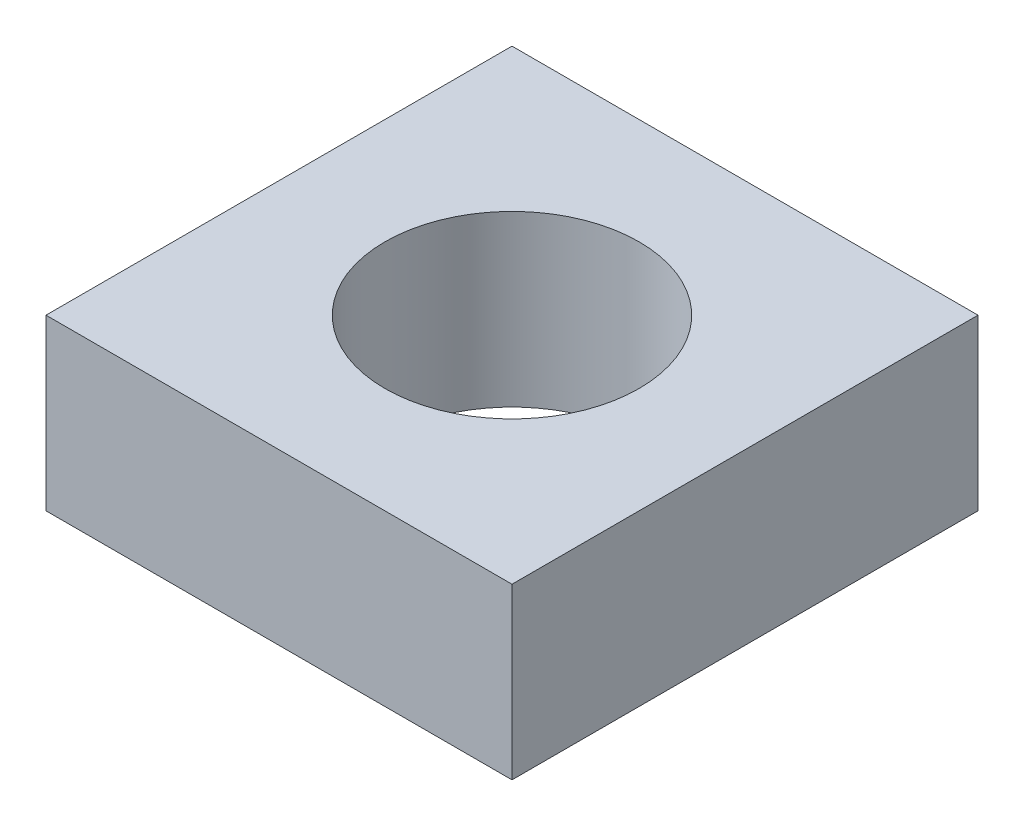
ISO-10303-21;
HEADER;
FILE_DESCRIPTION(('STEP AP214'),'2;1');
FILE_NAME('part.step','',(''),(''),'','','');
FILE_SCHEMA(('AUTOMOTIVE_DESIGN { 1 0 10303 214 1 1 1 1 }'));
ENDSEC;
DATA;
#1=APPLICATION_CONTEXT('core data for automotive mechanical design processes');
#2=APPLICATION_PROTOCOL_DEFINITION('international standard','automotive_design',2000,#1);
#3=PRODUCT_CONTEXT('',#1,'mechanical');
#4=PRODUCT('Part','Part','',(#3));
#5=PRODUCT_RELATED_PRODUCT_CATEGORY('part','',(#4));
#6=PRODUCT_DEFINITION_FORMATION('','',#4);
#7=PRODUCT_DEFINITION_CONTEXT('part definition',#1,'design');
#8=PRODUCT_DEFINITION('design','',#6,#7);
#9=PRODUCT_DEFINITION_SHAPE('','',#8);
#10=(LENGTH_UNIT() NAMED_UNIT(*) SI_UNIT(.MILLI.,.METRE.));
#11=(NAMED_UNIT(*) PLANE_ANGLE_UNIT() SI_UNIT($,.RADIAN.));
#12=(NAMED_UNIT(*) SI_UNIT($,.STERADIAN.) SOLID_ANGLE_UNIT());
#13=UNCERTAINTY_MEASURE_WITH_UNIT(LENGTH_MEASURE(1.E-05),#10,'distance_accuracy_value','');
#14=(GEOMETRIC_REPRESENTATION_CONTEXT(3) GLOBAL_UNCERTAINTY_ASSIGNED_CONTEXT((#13)) GLOBAL_UNIT_ASSIGNED_CONTEXT((#10,
#11,#12)) REPRESENTATION_CONTEXT('',''));
#15=CARTESIAN_POINT('',(0.,0.,0.));
#16=DIRECTION('',(0.,0.,1.));
#17=DIRECTION('',(1.,0.,0.));
#18=AXIS2_PLACEMENT_3D('',#15,#16,#17);
#19=CARTESIAN_POINT('',(0.,2.,0.));
#20=DIRECTION('',(0.,1.,0.));
#21=DIRECTION('',(0.,0.,1.));
#22=AXIS2_PLACEMENT_3D('',#19,#20,#21);
#23=PLANE('',#22);
#24=DIRECTION('',(0.,0.,-1.));
#25=VECTOR('',#24,1.);
#26=CARTESIAN_POINT('',(2.75,2.,-2.75));
#27=LINE('',#26,#25);
#28=CARTESIAN_POINT('',(2.75,2.,2.75));
#29=VERTEX_POINT('',#28);
#30=CARTESIAN_POINT('',(2.75,2.,-2.75));
#31=VERTEX_POINT('',#30);
#32=EDGE_CURVE('E92',#29,#31,#27,.T.);
#33=ORIENTED_EDGE('',*,*,#32,.T.);
#34=DIRECTION('',(-1.,0.,0.));
#35=VECTOR('',#34,1.);
#36=CARTESIAN_POINT('',(-2.75,2.,-2.75));
#37=LINE('',#36,#35);
#38=CARTESIAN_POINT('',(-2.75,2.,-2.75));
#39=VERTEX_POINT('',#38);
#40=EDGE_CURVE('E87',#31,#39,#37,.T.);
#41=ORIENTED_EDGE('',*,*,#40,.T.);
#42=DIRECTION('',(0.,0.,1.));
#43=VECTOR('',#42,1.);
#44=CARTESIAN_POINT('',(-2.75,2.,-2.75));
#45=LINE('',#44,#43);
#46=CARTESIAN_POINT('',(-2.75,2.,2.75));
#47=VERTEX_POINT('',#46);
#48=EDGE_CURVE('E90',#39,#47,#45,.T.);
#49=ORIENTED_EDGE('',*,*,#48,.T.);
#50=DIRECTION('',(1.,0.,0.));
#51=VECTOR('',#50,1.);
#52=CARTESIAN_POINT('',(-2.75,2.,2.75));
#53=LINE('',#52,#51);
#54=EDGE_CURVE('E57',#47,#29,#53,.T.);
#55=ORIENTED_EDGE('',*,*,#54,.T.);
#56=EDGE_LOOP('',(#33,#41,#49,#55));
#57=FACE_BOUND('',#56,.T.);
#58=CARTESIAN_POINT('',(0.,2.,0.));
#59=DIRECTION('',(0.,1.,0.));
#60=DIRECTION('',(0.,0.,1.));
#61=AXIS2_PLACEMENT_3D('',#58,#59,#60);
#62=CIRCLE('',#61,1.5);
#63=CARTESIAN_POINT('',(0.,2.,1.5));
#64=VERTEX_POINT('',#63);
#65=EDGE_CURVE('E112',#64,#64,#62,.T.);
#66=ORIENTED_EDGE('',*,*,#65,.F.);
#67=EDGE_LOOP('',(#66));
#68=FACE_BOUND('',#67,.T.);
#69=ADVANCED_FACE('F39',(#57,#68),#23,.T.);
#70=CARTESIAN_POINT('',(0.,0.,0.));
#71=DIRECTION('',(0.,1.,0.));
#72=DIRECTION('',(0.,0.,1.));
#73=AXIS2_PLACEMENT_3D('',#70,#71,#72);
#74=PLANE('',#73);
#75=DIRECTION('',(0.,0.,-1.));
#76=VECTOR('',#75,1.);
#77=CARTESIAN_POINT('',(2.75,0.,-2.75));
#78=LINE('',#77,#76);
#79=CARTESIAN_POINT('',(2.75,0.,2.75));
#80=VERTEX_POINT('',#79);
#81=CARTESIAN_POINT('',(2.75,0.,-2.75));
#82=VERTEX_POINT('',#81);
#83=EDGE_CURVE('E108',#80,#82,#78,.T.);
#84=ORIENTED_EDGE('',*,*,#83,.F.);
#85=DIRECTION('',(1.,0.,0.));
#86=VECTOR('',#85,1.);
#87=CARTESIAN_POINT('',(-2.75,0.,2.75));
#88=LINE('',#87,#86);
#89=CARTESIAN_POINT('',(-2.75,0.,2.75));
#90=VERTEX_POINT('',#89);
#91=EDGE_CURVE('E80',#90,#80,#88,.T.);
#92=ORIENTED_EDGE('',*,*,#91,.F.);
#93=DIRECTION('',(0.,0.,1.));
#94=VECTOR('',#93,1.);
#95=CARTESIAN_POINT('',(-2.75,0.,-2.75));
#96=LINE('',#95,#94);
#97=CARTESIAN_POINT('',(-2.75,0.,-2.75));
#98=VERTEX_POINT('',#97);
#99=EDGE_CURVE('E74',#98,#90,#96,.T.);
#100=ORIENTED_EDGE('',*,*,#99,.F.);
#101=DIRECTION('',(-1.,0.,0.));
#102=VECTOR('',#101,1.);
#103=CARTESIAN_POINT('',(-2.75,0.,-2.75));
#104=LINE('',#103,#102);
#105=EDGE_CURVE('E97',#82,#98,#104,.T.);
#106=ORIENTED_EDGE('',*,*,#105,.F.);
#107=EDGE_LOOP('',(#84,#92,#100,#106));
#108=FACE_BOUND('',#107,.T.);
#109=CARTESIAN_POINT('',(0.,0.,0.));
#110=DIRECTION('',(0.,1.,0.));
#111=DIRECTION('',(0.,0.,1.));
#112=AXIS2_PLACEMENT_3D('',#109,#110,#111);
#113=CIRCLE('',#112,1.5);
#114=CARTESIAN_POINT('',(0.,0.,1.5));
#115=VERTEX_POINT('',#114);
#116=EDGE_CURVE('E130',#115,#115,#113,.T.);
#117=ORIENTED_EDGE('',*,*,#116,.T.);
#118=EDGE_LOOP('',(#117));
#119=FACE_BOUND('',#118,.T.);
#120=ADVANCED_FACE('F125',(#108,#119),#74,.F.);
#121=CARTESIAN_POINT('',(2.75,2.,-2.75));
#122=DIRECTION('',(-1.,0.,0.));
#123=DIRECTION('',(0.,0.,1.));
#124=AXIS2_PLACEMENT_3D('',#121,#122,#123);
#125=PLANE('',#124);
#126=ORIENTED_EDGE('',*,*,#83,.T.);
#127=DIRECTION('',(0.,-1.,0.));
#128=VECTOR('',#127,1.);
#129=CARTESIAN_POINT('',(2.75,2.,-2.75));
#130=LINE('',#129,#128);
#131=EDGE_CURVE('E11',#31,#82,#130,.T.);
#132=ORIENTED_EDGE('',*,*,#131,.F.);
#133=ORIENTED_EDGE('',*,*,#32,.F.);
#134=DIRECTION('',(0.,-1.,0.));
#135=VECTOR('',#134,1.);
#136=CARTESIAN_POINT('',(2.75,2.,2.75));
#137=LINE('',#136,#135);
#138=EDGE_CURVE('E104',#29,#80,#137,.T.);
#139=ORIENTED_EDGE('',*,*,#138,.T.);
#140=EDGE_LOOP('',(#126,#132,#133,#139));
#141=FACE_BOUND('',#140,.T.);
#142=ADVANCED_FACE('F41',(#141),#125,.F.);
#143=CARTESIAN_POINT('',(-2.75,2.,-2.75));
#144=DIRECTION('',(0.,0.,1.));
#145=DIRECTION('',(1.,0.,0.));
#146=AXIS2_PLACEMENT_3D('',#143,#144,#145);
#147=PLANE('',#146);
#148=ORIENTED_EDGE('',*,*,#105,.T.);
#149=DIRECTION('',(0.,-1.,0.));
#150=VECTOR('',#149,1.);
#151=CARTESIAN_POINT('',(-2.75,2.,-2.75));
#152=LINE('',#151,#150);
#153=EDGE_CURVE('E49',#39,#98,#152,.T.);
#154=ORIENTED_EDGE('',*,*,#153,.F.);
#155=ORIENTED_EDGE('',*,*,#40,.F.);
#156=ORIENTED_EDGE('',*,*,#131,.T.);
#157=EDGE_LOOP('',(#148,#154,#155,#156));
#158=FACE_BOUND('',#157,.T.);
#159=ADVANCED_FACE('F96',(#158),#147,.F.);
#160=CARTESIAN_POINT('',(-2.75,2.,-2.75));
#161=DIRECTION('',(1.,0.,0.));
#162=DIRECTION('',(0.,0.,-1.));
#163=AXIS2_PLACEMENT_3D('',#160,#161,#162);
#164=PLANE('',#163);
#165=ORIENTED_EDGE('',*,*,#99,.T.);
#166=DIRECTION('',(0.,-1.,0.));
#167=VECTOR('',#166,1.);
#168=CARTESIAN_POINT('',(-2.75,2.,2.75));
#169=LINE('',#168,#167);
#170=EDGE_CURVE('E99',#47,#90,#169,.T.);
#171=ORIENTED_EDGE('',*,*,#170,.F.);
#172=ORIENTED_EDGE('',*,*,#48,.F.);
#173=ORIENTED_EDGE('',*,*,#153,.T.);
#174=EDGE_LOOP('',(#165,#171,#172,#173));
#175=FACE_BOUND('',#174,.T.);
#176=ADVANCED_FACE('F100',(#175),#164,.F.);
#177=CARTESIAN_POINT('',(-2.75,2.,2.75));
#178=DIRECTION('',(0.,0.,-1.));
#179=DIRECTION('',(-1.,0.,0.));
#180=AXIS2_PLACEMENT_3D('',#177,#178,#179);
#181=PLANE('',#180);
#182=ORIENTED_EDGE('',*,*,#91,.T.);
#183=ORIENTED_EDGE('',*,*,#138,.F.);
#184=ORIENTED_EDGE('',*,*,#54,.F.);
#185=ORIENTED_EDGE('',*,*,#170,.T.);
#186=EDGE_LOOP('',(#182,#183,#184,#185));
#187=FACE_BOUND('',#186,.T.);
#188=ADVANCED_FACE('F122',(#187),#181,.F.);
#189=CARTESIAN_POINT('',(0.,2.,0.));
#190=DIRECTION('',(0.,-1.,0.));
#191=DIRECTION('',(0.,0.,-1.));
#192=AXIS2_PLACEMENT_3D('',#189,#190,#191);
#193=CYLINDRICAL_SURFACE('',#192,1.5);
#194=ORIENTED_EDGE('',*,*,#65,.T.);
#195=EDGE_LOOP('',(#194));
#196=FACE_BOUND('',#195,.T.);
#197=ORIENTED_EDGE('',*,*,#116,.F.);
#198=EDGE_LOOP('',(#197));
#199=FACE_BOUND('',#198,.T.);
#200=ADVANCED_FACE('F138',(#196,#199),#193,.F.);
#201=CLOSED_SHELL('',(#69,#120,#142,#159,#176,#188,#200));
#202=MANIFOLD_SOLID_BREP('B2',#201);
#203=ADVANCED_BREP_SHAPE_REPRESENTATION('',(#18,#202),#14);
#204=SHAPE_DEFINITION_REPRESENTATION(#9,#203);
ENDSEC;
END-ISO-10303-21;
